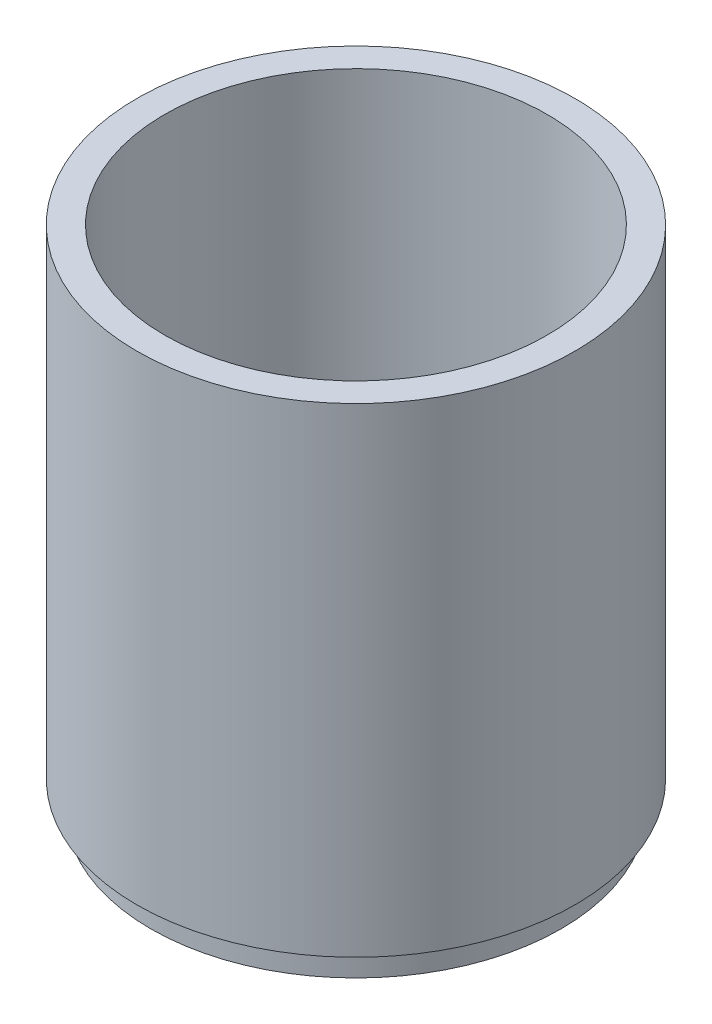
ISO-10303-21;
HEADER;
FILE_DESCRIPTION(('STEP AP214'),'2;1');
FILE_NAME('part.step','',(''),(''),'','','');
FILE_SCHEMA(('AUTOMOTIVE_DESIGN { 1 0 10303 214 1 1 1 1 }'));
ENDSEC;
DATA;
#1=APPLICATION_CONTEXT('core data for automotive mechanical design processes');
#2=APPLICATION_PROTOCOL_DEFINITION('international standard','automotive_design',2000,#1);
#3=PRODUCT_CONTEXT('',#1,'mechanical');
#4=PRODUCT('Part','Part','',(#3));
#5=PRODUCT_RELATED_PRODUCT_CATEGORY('part','',(#4));
#6=PRODUCT_DEFINITION_FORMATION('','',#4);
#7=PRODUCT_DEFINITION_CONTEXT('part definition',#1,'design');
#8=PRODUCT_DEFINITION('design','',#6,#7);
#9=PRODUCT_DEFINITION_SHAPE('','',#8);
#10=(LENGTH_UNIT() NAMED_UNIT(*) SI_UNIT(.MILLI.,.METRE.));
#11=(NAMED_UNIT(*) PLANE_ANGLE_UNIT() SI_UNIT($,.RADIAN.));
#12=(NAMED_UNIT(*) SI_UNIT($,.STERADIAN.) SOLID_ANGLE_UNIT());
#13=UNCERTAINTY_MEASURE_WITH_UNIT(LENGTH_MEASURE(1.E-05),#10,'distance_accuracy_value','');
#14=(GEOMETRIC_REPRESENTATION_CONTEXT(3) GLOBAL_UNCERTAINTY_ASSIGNED_CONTEXT((#13)) GLOBAL_UNIT_ASSIGNED_CONTEXT((#10,
#11,#12)) REPRESENTATION_CONTEXT('',''));
#15=CARTESIAN_POINT('',(0.,0.,0.));
#16=DIRECTION('',(0.,0.,1.));
#17=DIRECTION('',(1.,0.,0.));
#18=AXIS2_PLACEMENT_3D('',#15,#16,#17);
#19=CARTESIAN_POINT('',(0.,1.,0.));
#20=DIRECTION('',(0.,1.,0.));
#21=DIRECTION('',(0.,0.,1.));
#22=AXIS2_PLACEMENT_3D('',#19,#20,#21);
#23=PLANE('',#22);
#24=CARTESIAN_POINT('',(0.,1.,0.));
#25=DIRECTION('',(0.,1.,0.));
#26=DIRECTION('',(0.,0.,1.));
#27=AXIS2_PLACEMENT_3D('',#24,#25,#26);
#28=CIRCLE('',#27,6.4);
#29=CARTESIAN_POINT('',(0.,1.,6.4));
#30=VERTEX_POINT('',#29);
#31=EDGE_CURVE('E43',#30,#30,#28,.T.);
#32=ORIENTED_EDGE('',*,*,#31,.F.);
#33=EDGE_LOOP('',(#32));
#34=FACE_BOUND('',#33,.T.);
#35=CARTESIAN_POINT('',(0.,1.,0.));
#36=DIRECTION('',(0.,1.,0.));
#37=DIRECTION('',(0.,0.,1.));
#38=AXIS2_PLACEMENT_3D('',#35,#36,#37);
#39=CIRCLE('',#38,6.9);
#40=CARTESIAN_POINT('',(0.,1.,6.9));
#41=VERTEX_POINT('',#40);
#42=EDGE_CURVE('E57',#41,#41,#39,.T.);
#43=ORIENTED_EDGE('',*,*,#42,.T.);
#44=EDGE_LOOP('',(#43));
#45=FACE_BOUND('',#44,.T.);
#46=ADVANCED_FACE('F32',(#34,#45),#23,.T.);
#47=CARTESIAN_POINT('',(0.,0.,0.));
#48=DIRECTION('',(0.,1.,0.));
#49=DIRECTION('',(0.,0.,1.));
#50=AXIS2_PLACEMENT_3D('',#47,#48,#49);
#51=PLANE('',#50);
#52=CARTESIAN_POINT('',(0.,0.,0.));
#53=DIRECTION('',(0.,1.,0.));
#54=DIRECTION('',(0.,0.,1.));
#55=AXIS2_PLACEMENT_3D('',#52,#53,#54);
#56=CIRCLE('',#55,7.4);
#57=CARTESIAN_POINT('',(0.,0.,7.4));
#58=VERTEX_POINT('',#57);
#59=EDGE_CURVE('E36',#58,#58,#56,.T.);
#60=ORIENTED_EDGE('',*,*,#59,.F.);
#61=EDGE_LOOP('',(#60));
#62=FACE_BOUND('',#61,.T.);
#63=CARTESIAN_POINT('',(0.,0.,0.));
#64=DIRECTION('',(0.,1.,0.));
#65=DIRECTION('',(0.,0.,1.));
#66=AXIS2_PLACEMENT_3D('',#63,#64,#65);
#67=CIRCLE('',#66,6.4);
#68=CARTESIAN_POINT('',(0.,0.,6.4));
#69=VERTEX_POINT('',#68);
#70=EDGE_CURVE('E45',#69,#69,#67,.T.);
#71=ORIENTED_EDGE('',*,*,#70,.T.);
#72=EDGE_LOOP('',(#71));
#73=FACE_BOUND('',#72,.T.);
#74=ADVANCED_FACE('F83',(#62,#73),#51,.F.);
#75=CARTESIAN_POINT('',(0.,1.,0.));
#76=DIRECTION('',(0.,-1.,0.));
#77=DIRECTION('',(0.,0.,-1.));
#78=AXIS2_PLACEMENT_3D('',#75,#76,#77);
#79=CYLINDRICAL_SURFACE('',#78,7.4);
#80=CARTESIAN_POINT('',(0.,1.,0.));
#81=DIRECTION('',(0.,1.,0.));
#82=DIRECTION('',(0.,0.,1.));
#83=AXIS2_PLACEMENT_3D('',#80,#81,#82);
#84=CIRCLE('',#83,7.4);
#85=CARTESIAN_POINT('',(0.,1.,7.4));
#86=VERTEX_POINT('',#85);
#87=EDGE_CURVE('E10',#86,#86,#84,.T.);
#88=ORIENTED_EDGE('',*,*,#87,.F.);
#89=EDGE_LOOP('',(#88));
#90=FACE_BOUND('',#89,.T.);
#91=ORIENTED_EDGE('',*,*,#59,.T.);
#92=EDGE_LOOP('',(#91));
#93=FACE_BOUND('',#92,.T.);
#94=ADVANCED_FACE('F34',(#90,#93),#79,.T.);
#95=CARTESIAN_POINT('',(0.,1.,0.));
#96=DIRECTION('',(0.,-1.,0.));
#97=DIRECTION('',(0.,0.,-1.));
#98=AXIS2_PLACEMENT_3D('',#95,#96,#97);
#99=CYLINDRICAL_SURFACE('',#98,6.4);
#100=ORIENTED_EDGE('',*,*,#31,.T.);
#101=EDGE_LOOP('',(#100));
#102=FACE_BOUND('',#101,.T.);
#103=ORIENTED_EDGE('',*,*,#70,.F.);
#104=EDGE_LOOP('',(#103));
#105=FACE_BOUND('',#104,.T.);
#106=ADVANCED_FACE('F78',(#102,#105),#99,.F.);
#107=CARTESIAN_POINT('',(0.,1.,0.));
#108=DIRECTION('',(0.,1.,0.));
#109=DIRECTION('',(0.,0.,1.));
#110=AXIS2_PLACEMENT_3D('',#107,#108,#109);
#111=PLANE('',#110);
#112=CARTESIAN_POINT('',(0.,1.,0.));
#113=DIRECTION('',(0.,1.,0.));
#114=DIRECTION('',(0.,0.,1.));
#115=AXIS2_PLACEMENT_3D('',#112,#113,#114);
#116=CIRCLE('',#115,7.9);
#117=CARTESIAN_POINT('',(0.,1.,7.9));
#118=VERTEX_POINT('',#117);
#119=EDGE_CURVE('E51',#118,#118,#116,.T.);
#120=ORIENTED_EDGE('',*,*,#119,.F.);
#121=EDGE_LOOP('',(#120));
#122=FACE_BOUND('',#121,.T.);
#123=ORIENTED_EDGE('',*,*,#87,.T.);
#124=EDGE_LOOP('',(#123));
#125=FACE_BOUND('',#124,.T.);
#126=ADVANCED_FACE('F69',(#122,#125),#111,.F.);
#127=CARTESIAN_POINT('',(0.,18.3,0.));
#128=DIRECTION('',(0.,1.,0.));
#129=DIRECTION('',(0.,0.,1.));
#130=AXIS2_PLACEMENT_3D('',#127,#128,#129);
#131=PLANE('',#130);
#132=CARTESIAN_POINT('',(0.,18.3,0.));
#133=DIRECTION('',(0.,1.,0.));
#134=DIRECTION('',(0.,0.,1.));
#135=AXIS2_PLACEMENT_3D('',#132,#133,#134);
#136=CIRCLE('',#135,7.9);
#137=CARTESIAN_POINT('',(0.,18.3,7.9));
#138=VERTEX_POINT('',#137);
#139=EDGE_CURVE('E48',#138,#138,#136,.T.);
#140=ORIENTED_EDGE('',*,*,#139,.T.);
#141=EDGE_LOOP('',(#140));
#142=FACE_BOUND('',#141,.T.);
#143=CARTESIAN_POINT('',(0.,18.3,0.));
#144=DIRECTION('',(0.,1.,0.));
#145=DIRECTION('',(0.,0.,1.));
#146=AXIS2_PLACEMENT_3D('',#143,#144,#145);
#147=CIRCLE('',#146,6.9);
#148=CARTESIAN_POINT('',(0.,18.3,6.9));
#149=VERTEX_POINT('',#148);
#150=EDGE_CURVE('E54',#149,#149,#147,.T.);
#151=ORIENTED_EDGE('',*,*,#150,.F.);
#152=EDGE_LOOP('',(#151));
#153=FACE_BOUND('',#152,.T.);
#154=ADVANCED_FACE('F66',(#142,#153),#131,.T.);
#155=CARTESIAN_POINT('',(0.,18.3,0.));
#156=DIRECTION('',(0.,-1.,0.));
#157=DIRECTION('',(0.,0.,-1.));
#158=AXIS2_PLACEMENT_3D('',#155,#156,#157);
#159=CYLINDRICAL_SURFACE('',#158,7.9);
#160=ORIENTED_EDGE('',*,*,#139,.F.);
#161=EDGE_LOOP('',(#160));
#162=FACE_BOUND('',#161,.T.);
#163=ORIENTED_EDGE('',*,*,#119,.T.);
#164=EDGE_LOOP('',(#163));
#165=FACE_BOUND('',#164,.T.);
#166=ADVANCED_FACE('F68',(#162,#165),#159,.T.);
#167=CARTESIAN_POINT('',(0.,18.3,0.));
#168=DIRECTION('',(0.,-1.,0.));
#169=DIRECTION('',(0.,0.,-1.));
#170=AXIS2_PLACEMENT_3D('',#167,#168,#169);
#171=CYLINDRICAL_SURFACE('',#170,6.9);
#172=ORIENTED_EDGE('',*,*,#150,.T.);
#173=EDGE_LOOP('',(#172));
#174=FACE_BOUND('',#173,.T.);
#175=ORIENTED_EDGE('',*,*,#42,.F.);
#176=EDGE_LOOP('',(#175));
#177=FACE_BOUND('',#176,.T.);
#178=ADVANCED_FACE('F63',(#174,#177),#171,.F.);
#179=CLOSED_SHELL('',(#46,#74,#94,#106,#126,#154,#166,#178));
#180=MANIFOLD_SOLID_BREP('B2',#179);
#181=ADVANCED_BREP_SHAPE_REPRESENTATION('',(#18,#180),#14);
#182=SHAPE_DEFINITION_REPRESENTATION(#9,#181);
ENDSEC;
END-ISO-10303-21;
